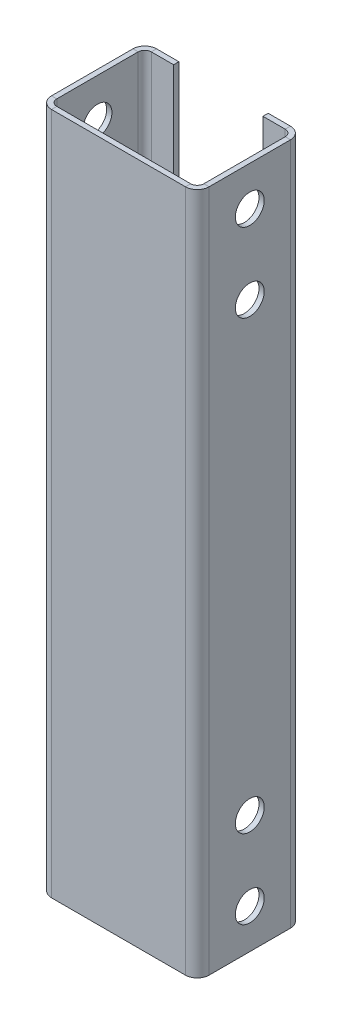
ISO-10303-21;
HEADER;
FILE_DESCRIPTION(('STEP AP214'),'2;1');
FILE_NAME('part.step','',(''),(''),'','','');
FILE_SCHEMA(('AUTOMOTIVE_DESIGN { 1 0 10303 214 1 1 1 1 }'));
ENDSEC;
DATA;
#1=APPLICATION_CONTEXT('core data for automotive mechanical design processes');
#2=APPLICATION_PROTOCOL_DEFINITION('international standard','automotive_design',2000,#1);
#3=PRODUCT_CONTEXT('',#1,'mechanical');
#4=PRODUCT('Part','Part','',(#3));
#5=PRODUCT_RELATED_PRODUCT_CATEGORY('part','',(#4));
#6=PRODUCT_DEFINITION_FORMATION('','',#4);
#7=PRODUCT_DEFINITION_CONTEXT('part definition',#1,'design');
#8=PRODUCT_DEFINITION('design','',#6,#7);
#9=PRODUCT_DEFINITION_SHAPE('','',#8);
#10=(LENGTH_UNIT() NAMED_UNIT(*) SI_UNIT(.MILLI.,.METRE.));
#11=(NAMED_UNIT(*) PLANE_ANGLE_UNIT() SI_UNIT($,.RADIAN.));
#12=(NAMED_UNIT(*) SI_UNIT($,.STERADIAN.) SOLID_ANGLE_UNIT());
#13=UNCERTAINTY_MEASURE_WITH_UNIT(LENGTH_MEASURE(1.E-05),#10,'distance_accuracy_value','');
#14=(GEOMETRIC_REPRESENTATION_CONTEXT(3) GLOBAL_UNCERTAINTY_ASSIGNED_CONTEXT((#13)) GLOBAL_UNIT_ASSIGNED_CONTEXT((#10,
#11,#12)) REPRESENTATION_CONTEXT('',''));
#15=CARTESIAN_POINT('',(0.,0.,0.));
#16=DIRECTION('',(0.,0.,1.));
#17=DIRECTION('',(1.,0.,0.));
#18=AXIS2_PLACEMENT_3D('',#15,#16,#17);
#19=CARTESIAN_POINT('',(-30.,130.,-1.99999999999999));
#20=DIRECTION('',(0.,1.,0.));
#21=DIRECTION('',(0.,0.,1.));
#22=AXIS2_PLACEMENT_3D('',#19,#20,#21);
#23=PLANE('',#22);
#24=DIRECTION('',(0.,0.,-1.));
#25=VECTOR('',#24,1.);
#26=CARTESIAN_POINT('',(-28.,130.,1.04083408558608E-13));
#27=LINE('',#26,#25);
#28=CARTESIAN_POINT('',(-28.0000000000001,130.,-35.5));
#29=VERTEX_POINT('',#28);
#30=CARTESIAN_POINT('',(-28.,130.,-4.49999999999999));
#31=VERTEX_POINT('',#30);
#32=EDGE_CURVE('E376',#29,#31,#27,.F.);
#33=ORIENTED_EDGE('',*,*,#32,.F.);
#34=DIRECTION('',(-1.,0.,0.));
#35=VECTOR('',#34,1.);
#36=CARTESIAN_POINT('',(-28.0000000000001,130.,-35.5));
#37=LINE('',#36,#35);
#38=CARTESIAN_POINT('',(-30.0000000000001,130.,-35.5));
#39=VERTEX_POINT('',#38);
#40=EDGE_CURVE('E304',#29,#39,#37,.T.);
#41=ORIENTED_EDGE('',*,*,#40,.T.);
#42=DIRECTION('',(0.,0.,1.));
#43=VECTOR('',#42,1.);
#44=CARTESIAN_POINT('',(-30.,130.,-1.99999999999999));
#45=LINE('',#44,#43);
#46=CARTESIAN_POINT('',(-30.,130.,-4.49999999999998));
#47=VERTEX_POINT('',#46);
#48=EDGE_CURVE('E370',#39,#47,#45,.T.);
#49=ORIENTED_EDGE('',*,*,#48,.T.);
#50=DIRECTION('',(-1.,0.,0.));
#51=VECTOR('',#50,1.);
#52=CARTESIAN_POINT('',(-28.,130.,-4.49999999999999));
#53=LINE('',#52,#51);
#54=EDGE_CURVE('E384',#31,#47,#53,.T.);
#55=ORIENTED_EDGE('',*,*,#54,.F.);
#56=EDGE_LOOP('',(#33,#41,#49,#55));
#57=FACE_BOUND('',#56,.T.);
#58=ADVANCED_FACE('F118',(#57),#23,.T.);
#59=CARTESIAN_POINT('',(-30.,0.,1.11066371236295E-13));
#60=DIRECTION('',(-1.,0.,0.));
#61=DIRECTION('',(0.,0.,1.));
#62=AXIS2_PLACEMENT_3D('',#59,#60,#61);
#63=PLANE('',#62);
#64=CARTESIAN_POINT('',(-30.0000000000003,115.,-20.));
#65=DIRECTION('',(-1.,0.,0.));
#66=DIRECTION('',(0.,0.,-1.));
#67=AXIS2_PLACEMENT_3D('',#64,#65,#66);
#68=CIRCLE('',#67,5.5);
#69=CARTESIAN_POINT('',(-30.0000000000002,115.,-25.5));
#70=VERTEX_POINT('',#69);
#71=EDGE_CURVE('E480',#70,#70,#68,.T.);
#72=ORIENTED_EDGE('',*,*,#71,.F.);
#73=EDGE_LOOP('',(#72));
#74=FACE_BOUND('',#73,.T.);
#75=CARTESIAN_POINT('',(-30.0000000000003,85.,-20.));
#76=DIRECTION('',(-1.,0.,0.));
#77=DIRECTION('',(0.,0.,-1.));
#78=AXIS2_PLACEMENT_3D('',#75,#76,#77);
#79=CIRCLE('',#78,5.5);
#80=CARTESIAN_POINT('',(-30.0000000000002,85.,-25.5));
#81=VERTEX_POINT('',#80);
#82=EDGE_CURVE('E487',#81,#81,#79,.T.);
#83=ORIENTED_EDGE('',*,*,#82,.F.);
#84=EDGE_LOOP('',(#83));
#85=FACE_BOUND('',#84,.T.);
#86=CARTESIAN_POINT('',(-30.0000000000002,-115.,-20.));
#87=DIRECTION('',(1.,0.,0.));
#88=DIRECTION('',(0.,0.,-1.));
#89=AXIS2_PLACEMENT_3D('',#86,#87,#88);
#90=CIRCLE('',#89,5.5);
#91=CARTESIAN_POINT('',(-30.0000000000002,-115.,-25.5));
#92=VERTEX_POINT('',#91);
#93=EDGE_CURVE('E472',#92,#92,#90,.T.);
#94=ORIENTED_EDGE('',*,*,#93,.T.);
#95=EDGE_LOOP('',(#94));
#96=FACE_BOUND('',#95,.T.);
#97=CARTESIAN_POINT('',(-30.0000000000002,-85.,-20.));
#98=DIRECTION('',(1.,0.,0.));
#99=DIRECTION('',(0.,0.,-1.));
#100=AXIS2_PLACEMENT_3D('',#97,#98,#99);
#101=CIRCLE('',#100,5.5);
#102=CARTESIAN_POINT('',(-30.0000000000002,-85.,-25.5));
#103=VERTEX_POINT('',#102);
#104=EDGE_CURVE('E502',#103,#103,#101,.T.);
#105=ORIENTED_EDGE('',*,*,#104,.T.);
#106=EDGE_LOOP('',(#105));
#107=FACE_BOUND('',#106,.T.);
#108=ORIENTED_EDGE('',*,*,#48,.F.);
#109=DIRECTION('',(0.,1.,0.));
#110=VECTOR('',#109,1.);
#111=CARTESIAN_POINT('',(-30.0000000000001,130.,-35.5));
#112=LINE('',#111,#110);
#113=CARTESIAN_POINT('',(-30.0000000000001,-130.,-35.5));
#114=VERTEX_POINT('',#113);
#115=EDGE_CURVE('E299',#39,#114,#112,.F.);
#116=ORIENTED_EDGE('',*,*,#115,.T.);
#117=DIRECTION('',(0.,0.,-1.));
#118=VECTOR('',#117,1.);
#119=CARTESIAN_POINT('',(-30.0000000000001,-130.,-40.));
#120=LINE('',#119,#118);
#121=CARTESIAN_POINT('',(-30.,-130.,-4.49999999999998));
#122=VERTEX_POINT('',#121);
#123=EDGE_CURVE('E373',#122,#114,#120,.T.);
#124=ORIENTED_EDGE('',*,*,#123,.F.);
#125=DIRECTION('',(0.,1.,0.));
#126=VECTOR('',#125,1.);
#127=CARTESIAN_POINT('',(-30.,0.,-4.49999999999998));
#128=LINE('',#127,#126);
#129=EDGE_CURVE('E381',#122,#47,#128,.T.);
#130=ORIENTED_EDGE('',*,*,#129,.T.);
#131=EDGE_LOOP('',(#108,#116,#124,#130));
#132=FACE_BOUND('',#131,.T.);
#133=ADVANCED_FACE('F543',(#74,#85,#96,#107,#132),#63,.T.);
#134=CARTESIAN_POINT('',(-28.,0.,1.04083408558608E-13));
#135=DIRECTION('',(-1.,0.,0.));
#136=DIRECTION('',(0.,0.,1.));
#137=AXIS2_PLACEMENT_3D('',#134,#135,#136);
#138=PLANE('',#137);
#139=CARTESIAN_POINT('',(-28.0000000000001,115.,-20.));
#140=DIRECTION('',(-1.,0.,0.));
#141=DIRECTION('',(0.,0.,1.));
#142=AXIS2_PLACEMENT_3D('',#139,#140,#141);
#143=CIRCLE('',#142,5.5);
#144=CARTESIAN_POINT('',(-28.,115.,-14.5));
#145=VERTEX_POINT('',#144);
#146=EDGE_CURVE('E499',#145,#145,#143,.F.);
#147=ORIENTED_EDGE('',*,*,#146,.F.);
#148=EDGE_LOOP('',(#147));
#149=FACE_BOUND('',#148,.T.);
#150=CARTESIAN_POINT('',(-28.0000000000001,85.,-20.));
#151=DIRECTION('',(-1.,0.,0.));
#152=DIRECTION('',(0.,0.,1.));
#153=AXIS2_PLACEMENT_3D('',#150,#151,#152);
#154=CIRCLE('',#153,5.5);
#155=CARTESIAN_POINT('',(-28.,85.,-14.5));
#156=VERTEX_POINT('',#155);
#157=EDGE_CURVE('E484',#156,#156,#154,.F.);
#158=ORIENTED_EDGE('',*,*,#157,.F.);
#159=EDGE_LOOP('',(#158));
#160=FACE_BOUND('',#159,.T.);
#161=CARTESIAN_POINT('',(-28.0000000000001,-115.,-20.));
#162=DIRECTION('',(-1.,0.,0.));
#163=DIRECTION('',(0.,0.,1.));
#164=AXIS2_PLACEMENT_3D('',#161,#162,#163);
#165=CIRCLE('',#164,5.5);
#166=CARTESIAN_POINT('',(-28.,-115.,-14.5));
#167=VERTEX_POINT('',#166);
#168=EDGE_CURVE('E298',#167,#167,#165,.T.);
#169=ORIENTED_EDGE('',*,*,#168,.T.);
#170=EDGE_LOOP('',(#169));
#171=FACE_BOUND('',#170,.T.);
#172=CARTESIAN_POINT('',(-28.0000000000001,-85.,-20.));
#173=DIRECTION('',(-1.,0.,0.));
#174=DIRECTION('',(0.,0.,1.));
#175=AXIS2_PLACEMENT_3D('',#172,#173,#174);
#176=CIRCLE('',#175,5.5);
#177=CARTESIAN_POINT('',(-28.,-85.,-14.5));
#178=VERTEX_POINT('',#177);
#179=EDGE_CURVE('E476',#178,#178,#176,.T.);
#180=ORIENTED_EDGE('',*,*,#179,.T.);
#181=EDGE_LOOP('',(#180));
#182=FACE_BOUND('',#181,.T.);
#183=DIRECTION('',(0.,1.,0.));
#184=VECTOR('',#183,1.);
#185=CARTESIAN_POINT('',(-28.0000000000001,130.,-35.5));
#186=LINE('',#185,#184);
#187=CARTESIAN_POINT('',(-28.0000000000001,-130.,-35.5));
#188=VERTEX_POINT('',#187);
#189=EDGE_CURVE('E310',#29,#188,#186,.F.);
#190=ORIENTED_EDGE('',*,*,#189,.F.);
#191=ORIENTED_EDGE('',*,*,#32,.T.);
#192=DIRECTION('',(0.,-1.,0.));
#193=VECTOR('',#192,1.);
#194=CARTESIAN_POINT('',(-28.,-130.,-4.49999999999999));
#195=LINE('',#194,#193);
#196=CARTESIAN_POINT('',(-28.,-130.,-4.49999999999999));
#197=VERTEX_POINT('',#196);
#198=EDGE_CURVE('E387',#197,#31,#195,.F.);
#199=ORIENTED_EDGE('',*,*,#198,.F.);
#200=DIRECTION('',(0.,0.,1.));
#201=VECTOR('',#200,1.);
#202=CARTESIAN_POINT('',(-28.,-130.,1.04083408558608E-13));
#203=LINE('',#202,#201);
#204=EDGE_CURVE('E378',#197,#188,#203,.F.);
#205=ORIENTED_EDGE('',*,*,#204,.T.);
#206=EDGE_LOOP('',(#190,#191,#199,#205));
#207=FACE_BOUND('',#206,.T.);
#208=ADVANCED_FACE('F549',(#149,#160,#171,#182,#207),#138,.F.);
#209=CARTESIAN_POINT('',(30.,-130.,-1.99999999999999));
#210=DIRECTION('',(0.,-1.,0.));
#211=DIRECTION('',(0.,0.,-1.));
#212=AXIS2_PLACEMENT_3D('',#209,#210,#211);
#213=PLANE('',#212);
#214=DIRECTION('',(0.,0.,-1.));
#215=VECTOR('',#214,1.);
#216=CARTESIAN_POINT('',(28.,-130.,1.04083408558608E-13));
#217=LINE('',#216,#215);
#218=CARTESIAN_POINT('',(28.0000000000001,-130.,-35.5));
#219=VERTEX_POINT('',#218);
#220=CARTESIAN_POINT('',(28.,-130.,-4.49999999999999));
#221=VERTEX_POINT('',#220);
#222=EDGE_CURVE('E421',#219,#221,#217,.F.);
#223=ORIENTED_EDGE('',*,*,#222,.F.);
#224=DIRECTION('',(1.,0.,0.));
#225=VECTOR('',#224,1.);
#226=CARTESIAN_POINT('',(28.0000000000001,-130.,-35.5));
#227=LINE('',#226,#225);
#228=CARTESIAN_POINT('',(30.0000000000001,-130.,-35.5));
#229=VERTEX_POINT('',#228);
#230=EDGE_CURVE('E355',#219,#229,#227,.T.);
#231=ORIENTED_EDGE('',*,*,#230,.T.);
#232=DIRECTION('',(0.,0.,1.));
#233=VECTOR('',#232,1.);
#234=CARTESIAN_POINT('',(30.,-130.,-1.99999999999999));
#235=LINE('',#234,#233);
#236=CARTESIAN_POINT('',(30.,-130.,-4.49999999999999));
#237=VERTEX_POINT('',#236);
#238=EDGE_CURVE('E415',#229,#237,#235,.T.);
#239=ORIENTED_EDGE('',*,*,#238,.T.);
#240=DIRECTION('',(1.,0.,0.));
#241=VECTOR('',#240,1.);
#242=CARTESIAN_POINT('',(28.,-130.,-4.5));
#243=LINE('',#242,#241);
#244=EDGE_CURVE('E430',#221,#237,#243,.T.);
#245=ORIENTED_EDGE('',*,*,#244,.F.);
#246=EDGE_LOOP('',(#223,#231,#239,#245));
#247=FACE_BOUND('',#246,.T.);
#248=ADVANCED_FACE('F581',(#247),#213,.T.);
#249=CARTESIAN_POINT('',(30.,0.,1.11066371236295E-13));
#250=DIRECTION('',(1.,0.,0.));
#251=DIRECTION('',(0.,0.,-1.));
#252=AXIS2_PLACEMENT_3D('',#249,#250,#251);
#253=PLANE('',#252);
#254=CARTESIAN_POINT('',(30.0000000000001,115.,-19.9999999999998));
#255=DIRECTION('',(1.,0.,0.));
#256=DIRECTION('',(0.,0.,-1.));
#257=AXIS2_PLACEMENT_3D('',#254,#255,#256);
#258=CIRCLE('',#257,5.5);
#259=CARTESIAN_POINT('',(30.0000000000001,115.,-25.4999999999998));
#260=VERTEX_POINT('',#259);
#261=EDGE_CURVE('E496',#260,#260,#258,.F.);
#262=ORIENTED_EDGE('',*,*,#261,.T.);
#263=EDGE_LOOP('',(#262));
#264=FACE_BOUND('',#263,.T.);
#265=CARTESIAN_POINT('',(30.0000000000001,85.,-19.9999999999998));
#266=DIRECTION('',(1.,0.,0.));
#267=DIRECTION('',(0.,0.,-1.));
#268=AXIS2_PLACEMENT_3D('',#265,#266,#267);
#269=CIRCLE('',#268,5.5);
#270=CARTESIAN_POINT('',(30.0000000000001,85.,-25.4999999999998));
#271=VERTEX_POINT('',#270);
#272=EDGE_CURVE('E479',#271,#271,#269,.F.);
#273=ORIENTED_EDGE('',*,*,#272,.T.);
#274=EDGE_LOOP('',(#273));
#275=FACE_BOUND('',#274,.T.);
#276=CARTESIAN_POINT('',(30.0000000000001,-115.,-19.9999999999998));
#277=DIRECTION('',(1.,0.,0.));
#278=DIRECTION('',(0.,0.,-1.));
#279=AXIS2_PLACEMENT_3D('',#276,#277,#278);
#280=CIRCLE('',#279,5.5);
#281=CARTESIAN_POINT('',(30.0000000000001,-115.,-25.4999999999998));
#282=VERTEX_POINT('',#281);
#283=EDGE_CURVE('E475',#282,#282,#280,.T.);
#284=ORIENTED_EDGE('',*,*,#283,.F.);
#285=EDGE_LOOP('',(#284));
#286=FACE_BOUND('',#285,.T.);
#287=CARTESIAN_POINT('',(30.0000000000001,-85.,-19.9999999999998));
#288=DIRECTION('',(1.,0.,0.));
#289=DIRECTION('',(0.,0.,-1.));
#290=AXIS2_PLACEMENT_3D('',#287,#288,#289);
#291=CIRCLE('',#290,5.5);
#292=CARTESIAN_POINT('',(30.0000000000001,-85.,-25.4999999999998));
#293=VERTEX_POINT('',#292);
#294=EDGE_CURVE('E471',#293,#293,#291,.T.);
#295=ORIENTED_EDGE('',*,*,#294,.F.);
#296=EDGE_LOOP('',(#295));
#297=FACE_BOUND('',#296,.T.);
#298=ORIENTED_EDGE('',*,*,#238,.F.);
#299=DIRECTION('',(0.,-1.,0.));
#300=VECTOR('',#299,1.);
#301=CARTESIAN_POINT('',(30.0000000000001,-130.,-35.5));
#302=LINE('',#301,#300);
#303=CARTESIAN_POINT('',(30.0000000000001,130.,-35.5));
#304=VERTEX_POINT('',#303);
#305=EDGE_CURVE('E350',#229,#304,#302,.F.);
#306=ORIENTED_EDGE('',*,*,#305,.T.);
#307=DIRECTION('',(0.,0.,-1.));
#308=VECTOR('',#307,1.);
#309=CARTESIAN_POINT('',(30.0000000000001,130.,-40.));
#310=LINE('',#309,#308);
#311=CARTESIAN_POINT('',(30.,130.,-4.49999999999999));
#312=VERTEX_POINT('',#311);
#313=EDGE_CURVE('E418',#312,#304,#310,.T.);
#314=ORIENTED_EDGE('',*,*,#313,.F.);
#315=DIRECTION('',(0.,-1.,0.));
#316=VECTOR('',#315,1.);
#317=CARTESIAN_POINT('',(30.,0.,-4.49999999999999));
#318=LINE('',#317,#316);
#319=EDGE_CURVE('E426',#312,#237,#318,.T.);
#320=ORIENTED_EDGE('',*,*,#319,.T.);
#321=EDGE_LOOP('',(#298,#306,#314,#320));
#322=FACE_BOUND('',#321,.T.);
#323=ADVANCED_FACE('F577',(#264,#275,#286,#297,#322),#253,.T.);
#324=CARTESIAN_POINT('',(28.,0.,1.04083408558608E-13));
#325=DIRECTION('',(1.,0.,0.));
#326=DIRECTION('',(0.,0.,-1.));
#327=AXIS2_PLACEMENT_3D('',#324,#325,#326);
#328=PLANE('',#327);
#329=CARTESIAN_POINT('',(28.0000000000001,115.,-19.9999999999998));
#330=DIRECTION('',(1.,0.,0.));
#331=DIRECTION('',(0.,0.,-1.));
#332=AXIS2_PLACEMENT_3D('',#329,#330,#331);
#333=CIRCLE('',#332,5.5);
#334=CARTESIAN_POINT('',(28.0000000000001,115.,-25.4999999999998));
#335=VERTEX_POINT('',#334);
#336=EDGE_CURVE('E122',#335,#335,#333,.F.);
#337=ORIENTED_EDGE('',*,*,#336,.F.);
#338=EDGE_LOOP('',(#337));
#339=FACE_BOUND('',#338,.T.);
#340=CARTESIAN_POINT('',(28.0000000000001,85.,-19.9999999999998));
#341=DIRECTION('',(1.,0.,0.));
#342=DIRECTION('',(0.,0.,-1.));
#343=AXIS2_PLACEMENT_3D('',#340,#341,#342);
#344=CIRCLE('',#343,5.5);
#345=CARTESIAN_POINT('',(28.0000000000001,85.,-25.4999999999998));
#346=VERTEX_POINT('',#345);
#347=EDGE_CURVE('E477',#346,#346,#344,.F.);
#348=ORIENTED_EDGE('',*,*,#347,.F.);
#349=EDGE_LOOP('',(#348));
#350=FACE_BOUND('',#349,.T.);
#351=CARTESIAN_POINT('',(28.0000000000001,-115.,-19.9999999999998));
#352=DIRECTION('',(1.,0.,0.));
#353=DIRECTION('',(0.,0.,-1.));
#354=AXIS2_PLACEMENT_3D('',#351,#352,#353);
#355=CIRCLE('',#354,5.5);
#356=CARTESIAN_POINT('',(28.0000000000001,-115.,-25.4999999999998));
#357=VERTEX_POINT('',#356);
#358=EDGE_CURVE('E473',#357,#357,#355,.T.);
#359=ORIENTED_EDGE('',*,*,#358,.T.);
#360=EDGE_LOOP('',(#359));
#361=FACE_BOUND('',#360,.T.);
#362=CARTESIAN_POINT('',(28.0000000000001,-85.,-19.9999999999998));
#363=DIRECTION('',(1.,0.,0.));
#364=DIRECTION('',(0.,0.,-1.));
#365=AXIS2_PLACEMENT_3D('',#362,#363,#364);
#366=CIRCLE('',#365,5.5);
#367=CARTESIAN_POINT('',(28.0000000000001,-85.,-25.4999999999998));
#368=VERTEX_POINT('',#367);
#369=EDGE_CURVE('E468',#368,#368,#366,.T.);
#370=ORIENTED_EDGE('',*,*,#369,.T.);
#371=EDGE_LOOP('',(#370));
#372=FACE_BOUND('',#371,.T.);
#373=DIRECTION('',(0.,-1.,0.));
#374=VECTOR('',#373,1.);
#375=CARTESIAN_POINT('',(28.0000000000001,-130.,-35.5));
#376=LINE('',#375,#374);
#377=CARTESIAN_POINT('',(28.0000000000001,130.,-35.5));
#378=VERTEX_POINT('',#377);
#379=EDGE_CURVE('E361',#219,#378,#376,.F.);
#380=ORIENTED_EDGE('',*,*,#379,.F.);
#381=ORIENTED_EDGE('',*,*,#222,.T.);
#382=DIRECTION('',(0.,1.,0.));
#383=VECTOR('',#382,1.);
#384=CARTESIAN_POINT('',(28.,130.,-4.49999999999999));
#385=LINE('',#384,#383);
#386=CARTESIAN_POINT('',(28.,130.,-4.49999999999999));
#387=VERTEX_POINT('',#386);
#388=EDGE_CURVE('E433',#387,#221,#385,.F.);
#389=ORIENTED_EDGE('',*,*,#388,.F.);
#390=DIRECTION('',(0.,0.,1.));
#391=VECTOR('',#390,1.);
#392=CARTESIAN_POINT('',(28.,130.,1.04083408558608E-13));
#393=LINE('',#392,#391);
#394=EDGE_CURVE('E423',#387,#378,#393,.F.);
#395=ORIENTED_EDGE('',*,*,#394,.T.);
#396=EDGE_LOOP('',(#380,#381,#389,#395));
#397=FACE_BOUND('',#396,.T.);
#398=ADVANCED_FACE('F580',(#339,#350,#361,#372,#397),#328,.F.);
#399=CARTESIAN_POINT('',(0.,0.,-2.));
#400=DIRECTION('',(0.,0.,-1.));
#401=DIRECTION('',(-1.,0.,0.));
#402=AXIS2_PLACEMENT_3D('',#399,#400,#401);
#403=PLANE('',#402);
#404=DIRECTION('',(1.,0.,0.));
#405=VECTOR('',#404,1.);
#406=CARTESIAN_POINT('',(-30.,-130.,-2.));
#407=LINE('',#406,#405);
#408=CARTESIAN_POINT('',(-25.5,-130.,-2.));
#409=VERTEX_POINT('',#408);
#410=CARTESIAN_POINT('',(25.5,-130.,-2.));
#411=VERTEX_POINT('',#410);
#412=EDGE_CURVE('E13',#409,#411,#407,.T.);
#413=ORIENTED_EDGE('',*,*,#412,.F.);
#414=DIRECTION('',(0.,1.,0.));
#415=VECTOR('',#414,1.);
#416=CARTESIAN_POINT('',(-25.5,130.,-2.));
#417=LINE('',#416,#415);
#418=CARTESIAN_POINT('',(-25.5,130.,-2.));
#419=VERTEX_POINT('',#418);
#420=EDGE_CURVE('E404',#419,#409,#417,.F.);
#421=ORIENTED_EDGE('',*,*,#420,.F.);
#422=DIRECTION('',(-1.,0.,0.));
#423=VECTOR('',#422,1.);
#424=CARTESIAN_POINT('',(-30.,130.,-2.));
#425=LINE('',#424,#423);
#426=CARTESIAN_POINT('',(25.5,130.,-2.));
#427=VERTEX_POINT('',#426);
#428=EDGE_CURVE('E127',#427,#419,#425,.T.);
#429=ORIENTED_EDGE('',*,*,#428,.F.);
#430=DIRECTION('',(0.,-1.,0.));
#431=VECTOR('',#430,1.);
#432=CARTESIAN_POINT('',(25.5,-130.,-2.));
#433=LINE('',#432,#431);
#434=EDGE_CURVE('E451',#411,#427,#433,.F.);
#435=ORIENTED_EDGE('',*,*,#434,.F.);
#436=EDGE_LOOP('',(#413,#421,#429,#435));
#437=FACE_BOUND('',#436,.T.);
#438=ADVANCED_FACE('F585',(#437),#403,.T.);
#439=CARTESIAN_POINT('',(0.,0.,0.));
#440=DIRECTION('',(0.,0.,-1.));
#441=DIRECTION('',(-1.,0.,0.));
#442=AXIS2_PLACEMENT_3D('',#439,#440,#441);
#443=PLANE('',#442);
#444=DIRECTION('',(0.,1.,0.));
#445=VECTOR('',#444,1.);
#446=CARTESIAN_POINT('',(-25.5,130.,0.));
#447=LINE('',#446,#445);
#448=CARTESIAN_POINT('',(-25.5,130.,0.));
#449=VERTEX_POINT('',#448);
#450=CARTESIAN_POINT('',(-25.5,-130.,0.));
#451=VERTEX_POINT('',#450);
#452=EDGE_CURVE('E392',#449,#451,#447,.F.);
#453=ORIENTED_EDGE('',*,*,#452,.T.);
#454=DIRECTION('',(1.,0.,0.));
#455=VECTOR('',#454,1.);
#456=CARTESIAN_POINT('',(-30.,-130.,0.));
#457=LINE('',#456,#455);
#458=CARTESIAN_POINT('',(25.5,-130.,0.));
#459=VERTEX_POINT('',#458);
#460=EDGE_CURVE('E463',#451,#459,#457,.T.);
#461=ORIENTED_EDGE('',*,*,#460,.T.);
#462=DIRECTION('',(0.,-1.,0.));
#463=VECTOR('',#462,1.);
#464=CARTESIAN_POINT('',(25.5,-130.,0.));
#465=LINE('',#464,#463);
#466=CARTESIAN_POINT('',(25.5,130.,0.));
#467=VERTEX_POINT('',#466);
#468=EDGE_CURVE('E439',#459,#467,#465,.F.);
#469=ORIENTED_EDGE('',*,*,#468,.T.);
#470=DIRECTION('',(-1.,0.,0.));
#471=VECTOR('',#470,1.);
#472=CARTESIAN_POINT('',(-30.,130.,0.));
#473=LINE('',#472,#471);
#474=EDGE_CURVE('E459',#467,#449,#473,.T.);
#475=ORIENTED_EDGE('',*,*,#474,.T.);
#476=EDGE_LOOP('',(#453,#461,#469,#475));
#477=FACE_BOUND('',#476,.T.);
#478=ADVANCED_FACE('F612',(#477),#443,.F.);
#479=CARTESIAN_POINT('',(-30.,130.,-2.));
#480=DIRECTION('',(0.,1.,0.));
#481=DIRECTION('',(0.,0.,1.));
#482=AXIS2_PLACEMENT_3D('',#479,#480,#481);
#483=PLANE('',#482);
#484=ORIENTED_EDGE('',*,*,#428,.T.);
#485=DIRECTION('',(0.,0.,1.));
#486=VECTOR('',#485,1.);
#487=CARTESIAN_POINT('',(-25.5,130.,-2.));
#488=LINE('',#487,#486);
#489=EDGE_CURVE('E398',#419,#449,#488,.T.);
#490=ORIENTED_EDGE('',*,*,#489,.T.);
#491=ORIENTED_EDGE('',*,*,#474,.F.);
#492=DIRECTION('',(0.,0.,1.));
#493=VECTOR('',#492,1.);
#494=CARTESIAN_POINT('',(25.5,130.,-2.));
#495=LINE('',#494,#493);
#496=EDGE_CURVE('E456',#427,#467,#495,.T.);
#497=ORIENTED_EDGE('',*,*,#496,.F.);
#498=EDGE_LOOP('',(#484,#490,#491,#497));
#499=FACE_BOUND('',#498,.T.);
#500=ADVANCED_FACE('F120',(#499),#483,.T.);
#501=CARTESIAN_POINT('',(-30.,-130.,-2.));
#502=DIRECTION('',(0.,-1.,0.));
#503=DIRECTION('',(0.,0.,-1.));
#504=AXIS2_PLACEMENT_3D('',#501,#502,#503);
#505=PLANE('',#504);
#506=DIRECTION('',(0.,0.,1.));
#507=VECTOR('',#506,1.);
#508=CARTESIAN_POINT('',(-25.5,-130.,-2.));
#509=LINE('',#508,#507);
#510=EDGE_CURVE('E409',#409,#451,#509,.T.);
#511=ORIENTED_EDGE('',*,*,#510,.F.);
#512=ORIENTED_EDGE('',*,*,#412,.T.);
#513=DIRECTION('',(0.,0.,1.));
#514=VECTOR('',#513,1.);
#515=CARTESIAN_POINT('',(25.5,-130.,-2.));
#516=LINE('',#515,#514);
#517=EDGE_CURVE('E445',#411,#459,#516,.T.);
#518=ORIENTED_EDGE('',*,*,#517,.T.);
#519=ORIENTED_EDGE('',*,*,#460,.F.);
#520=EDGE_LOOP('',(#511,#512,#518,#519));
#521=FACE_BOUND('',#520,.T.);
#522=ADVANCED_FACE('F605',(#521),#505,.T.);
#523=CARTESIAN_POINT('',(25.5,130.,-4.5));
#524=DIRECTION('',(0.,1.,0.));
#525=DIRECTION('',(0.,0.,1.));
#526=AXIS2_PLACEMENT_3D('',#523,#524,#525);
#527=PLANE('',#526);
#528=DIRECTION('',(1.,0.,0.));
#529=VECTOR('',#528,1.);
#530=CARTESIAN_POINT('',(30.,130.,-4.49999999999998));
#531=LINE('',#530,#529);
#532=EDGE_CURVE('E412',#387,#312,#531,.T.);
#533=ORIENTED_EDGE('',*,*,#532,.F.);
#534=CARTESIAN_POINT('',(25.5,130.,-4.5));
#535=DIRECTION('',(0.,-1.,0.));
#536=DIRECTION('',(0.,0.,-1.));
#537=AXIS2_PLACEMENT_3D('',#534,#535,#536);
#538=CIRCLE('',#537,2.5);
#539=EDGE_CURVE('E448',#427,#387,#538,.F.);
#540=ORIENTED_EDGE('',*,*,#539,.F.);
#541=ORIENTED_EDGE('',*,*,#496,.T.);
#542=CARTESIAN_POINT('',(25.5,130.,-4.5));
#543=DIRECTION('',(0.,-1.,0.));
#544=DIRECTION('',(0.,0.,-1.));
#545=AXIS2_PLACEMENT_3D('',#542,#543,#544);
#546=CIRCLE('',#545,4.5);
#547=EDGE_CURVE('E441',#467,#312,#546,.F.);
#548=ORIENTED_EDGE('',*,*,#547,.T.);
#549=EDGE_LOOP('',(#533,#540,#541,#548));
#550=FACE_BOUND('',#549,.T.);
#551=ADVANCED_FACE('F602',(#550),#527,.T.);
#552=CARTESIAN_POINT('',(25.5,-130.,-4.5));
#553=DIRECTION('',(0.,1.,0.));
#554=DIRECTION('',(0.,0.,1.));
#555=AXIS2_PLACEMENT_3D('',#552,#553,#554);
#556=PLANE('',#555);
#557=CARTESIAN_POINT('',(25.5,-130.,-4.5));
#558=DIRECTION('',(0.,-1.,0.));
#559=DIRECTION('',(0.,0.,-1.));
#560=AXIS2_PLACEMENT_3D('',#557,#558,#559);
#561=CIRCLE('',#560,2.5);
#562=EDGE_CURVE('E417',#221,#411,#561,.T.);
#563=ORIENTED_EDGE('',*,*,#562,.F.);
#564=ORIENTED_EDGE('',*,*,#244,.T.);
#565=CARTESIAN_POINT('',(25.5,-130.,-4.5));
#566=DIRECTION('',(0.,-1.,0.));
#567=DIRECTION('',(0.,0.,-1.));
#568=AXIS2_PLACEMENT_3D('',#565,#566,#567);
#569=CIRCLE('',#568,4.5);
#570=EDGE_CURVE('E442',#237,#459,#569,.T.);
#571=ORIENTED_EDGE('',*,*,#570,.T.);
#572=ORIENTED_EDGE('',*,*,#517,.F.);
#573=EDGE_LOOP('',(#563,#564,#571,#572));
#574=FACE_BOUND('',#573,.T.);
#575=ADVANCED_FACE('F597',(#574),#556,.F.);
#576=CARTESIAN_POINT('',(25.5,-130.,-4.5));
#577=DIRECTION('',(0.,-1.,0.));
#578=DIRECTION('',(1.,0.,0.));
#579=AXIS2_PLACEMENT_3D('',#576,#577,#578);
#580=CYLINDRICAL_SURFACE('',#579,4.5);
#581=ORIENTED_EDGE('',*,*,#468,.F.);
#582=ORIENTED_EDGE('',*,*,#570,.F.);
#583=ORIENTED_EDGE('',*,*,#319,.F.);
#584=ORIENTED_EDGE('',*,*,#547,.F.);
#585=EDGE_LOOP('',(#581,#582,#583,#584));
#586=FACE_BOUND('',#585,.T.);
#587=ADVANCED_FACE('F594',(#586),#580,.T.);
#588=CARTESIAN_POINT('',(25.5,-130.,-4.5));
#589=DIRECTION('',(0.,-1.,0.));
#590=DIRECTION('',(1.,0.,0.));
#591=AXIS2_PLACEMENT_3D('',#588,#589,#590);
#592=CYLINDRICAL_SURFACE('',#591,2.5);
#593=ORIENTED_EDGE('',*,*,#434,.T.);
#594=ORIENTED_EDGE('',*,*,#539,.T.);
#595=ORIENTED_EDGE('',*,*,#388,.T.);
#596=ORIENTED_EDGE('',*,*,#562,.T.);
#597=EDGE_LOOP('',(#593,#594,#595,#596));
#598=FACE_BOUND('',#597,.T.);
#599=ADVANCED_FACE('F592',(#598),#592,.F.);
#600=CARTESIAN_POINT('',(30.0000000000001,130.,-40.));
#601=DIRECTION('',(0.,1.,0.));
#602=DIRECTION('',(0.,0.,1.));
#603=AXIS2_PLACEMENT_3D('',#600,#601,#602);
#604=PLANE('',#603);
#605=DIRECTION('',(1.,0.,0.));
#606=VECTOR('',#605,1.);
#607=CARTESIAN_POINT('',(28.0000000000001,130.,-35.5));
#608=LINE('',#607,#606);
#609=EDGE_CURVE('E365',#378,#304,#608,.T.);
#610=ORIENTED_EDGE('',*,*,#609,.F.);
#611=ORIENTED_EDGE('',*,*,#394,.F.);
#612=ORIENTED_EDGE('',*,*,#532,.T.);
#613=ORIENTED_EDGE('',*,*,#313,.T.);
#614=EDGE_LOOP('',(#610,#611,#612,#613));
#615=FACE_BOUND('',#614,.T.);
#616=ADVANCED_FACE('F572',(#615),#604,.T.);
#617=CARTESIAN_POINT('',(-25.5,-130.,-4.5));
#618=DIRECTION('',(0.,-1.,0.));
#619=DIRECTION('',(0.,0.,-1.));
#620=AXIS2_PLACEMENT_3D('',#617,#618,#619);
#621=PLANE('',#620);
#622=DIRECTION('',(-1.,0.,0.));
#623=VECTOR('',#622,1.);
#624=CARTESIAN_POINT('',(-30.,-130.,-4.49999999999998));
#625=LINE('',#624,#623);
#626=EDGE_CURVE('E367',#197,#122,#625,.T.);
#627=ORIENTED_EDGE('',*,*,#626,.F.);
#628=CARTESIAN_POINT('',(-25.5,-130.,-4.5));
#629=DIRECTION('',(0.,1.,0.));
#630=DIRECTION('',(0.,0.,1.));
#631=AXIS2_PLACEMENT_3D('',#628,#629,#630);
#632=CIRCLE('',#631,2.5);
#633=EDGE_CURVE('E401',#409,#197,#632,.F.);
#634=ORIENTED_EDGE('',*,*,#633,.F.);
#635=ORIENTED_EDGE('',*,*,#510,.T.);
#636=CARTESIAN_POINT('',(-25.5,-130.,-4.5));
#637=DIRECTION('',(0.,1.,0.));
#638=DIRECTION('',(0.,0.,1.));
#639=AXIS2_PLACEMENT_3D('',#636,#637,#638);
#640=CIRCLE('',#639,4.5);
#641=EDGE_CURVE('E394',#451,#122,#640,.F.);
#642=ORIENTED_EDGE('',*,*,#641,.T.);
#643=EDGE_LOOP('',(#627,#634,#635,#642));
#644=FACE_BOUND('',#643,.T.);
#645=ADVANCED_FACE('F569',(#644),#621,.T.);
#646=CARTESIAN_POINT('',(-25.5,130.,-4.5));
#647=DIRECTION('',(0.,-1.,0.));
#648=DIRECTION('',(0.,0.,-1.));
#649=AXIS2_PLACEMENT_3D('',#646,#647,#648);
#650=PLANE('',#649);
#651=CARTESIAN_POINT('',(-25.5,130.,-4.5));
#652=DIRECTION('',(0.,1.,0.));
#653=DIRECTION('',(0.,0.,1.));
#654=AXIS2_PLACEMENT_3D('',#651,#652,#653);
#655=CIRCLE('',#654,2.5);
#656=EDGE_CURVE('E372',#31,#419,#655,.T.);
#657=ORIENTED_EDGE('',*,*,#656,.F.);
#658=ORIENTED_EDGE('',*,*,#54,.T.);
#659=CARTESIAN_POINT('',(-25.5,130.,-4.5));
#660=DIRECTION('',(0.,1.,0.));
#661=DIRECTION('',(0.,0.,1.));
#662=AXIS2_PLACEMENT_3D('',#659,#660,#661);
#663=CIRCLE('',#662,4.5);
#664=EDGE_CURVE('E395',#47,#449,#663,.T.);
#665=ORIENTED_EDGE('',*,*,#664,.T.);
#666=ORIENTED_EDGE('',*,*,#489,.F.);
#667=EDGE_LOOP('',(#657,#658,#665,#666));
#668=FACE_BOUND('',#667,.T.);
#669=ADVANCED_FACE('F564',(#668),#650,.F.);
#670=CARTESIAN_POINT('',(-25.5,130.,-4.5));
#671=DIRECTION('',(0.,1.,0.));
#672=DIRECTION('',(-1.,0.,0.));
#673=AXIS2_PLACEMENT_3D('',#670,#671,#672);
#674=CYLINDRICAL_SURFACE('',#673,4.5);
#675=ORIENTED_EDGE('',*,*,#452,.F.);
#676=ORIENTED_EDGE('',*,*,#664,.F.);
#677=ORIENTED_EDGE('',*,*,#129,.F.);
#678=ORIENTED_EDGE('',*,*,#641,.F.);
#679=EDGE_LOOP('',(#675,#676,#677,#678));
#680=FACE_BOUND('',#679,.T.);
#681=ADVANCED_FACE('F561',(#680),#674,.T.);
#682=CARTESIAN_POINT('',(-25.5,130.,-4.5));
#683=DIRECTION('',(0.,1.,0.));
#684=DIRECTION('',(-1.,0.,0.));
#685=AXIS2_PLACEMENT_3D('',#682,#683,#684);
#686=CYLINDRICAL_SURFACE('',#685,2.5);
#687=ORIENTED_EDGE('',*,*,#420,.T.);
#688=ORIENTED_EDGE('',*,*,#633,.T.);
#689=ORIENTED_EDGE('',*,*,#198,.T.);
#690=ORIENTED_EDGE('',*,*,#656,.T.);
#691=EDGE_LOOP('',(#687,#688,#689,#690));
#692=FACE_BOUND('',#691,.T.);
#693=ADVANCED_FACE('F559',(#692),#686,.F.);
#694=CARTESIAN_POINT('',(-30.0000000000001,-130.,-40.));
#695=DIRECTION('',(0.,-1.,0.));
#696=DIRECTION('',(0.,0.,-1.));
#697=AXIS2_PLACEMENT_3D('',#694,#695,#696);
#698=PLANE('',#697);
#699=DIRECTION('',(-1.,0.,0.));
#700=VECTOR('',#699,1.);
#701=CARTESIAN_POINT('',(-28.0000000000001,-130.,-35.5));
#702=LINE('',#701,#700);
#703=EDGE_CURVE('E315',#188,#114,#702,.T.);
#704=ORIENTED_EDGE('',*,*,#703,.F.);
#705=ORIENTED_EDGE('',*,*,#204,.F.);
#706=ORIENTED_EDGE('',*,*,#626,.T.);
#707=ORIENTED_EDGE('',*,*,#123,.T.);
#708=EDGE_LOOP('',(#704,#705,#706,#707));
#709=FACE_BOUND('',#708,.T.);
#710=ADVANCED_FACE('F555',(#709),#698,.T.);
#711=CARTESIAN_POINT('',(25.5000000000001,130.,-35.5));
#712=DIRECTION('',(0.,1.,0.));
#713=DIRECTION('',(0.,0.,1.));
#714=AXIS2_PLACEMENT_3D('',#711,#712,#713);
#715=PLANE('',#714);
#716=DIRECTION('',(0.,0.,1.));
#717=VECTOR('',#716,1.);
#718=CARTESIAN_POINT('',(25.5000000000001,130.,-40.));
#719=LINE('',#718,#717);
#720=CARTESIAN_POINT('',(25.5000000000001,130.,-38.));
#721=VERTEX_POINT('',#720);
#722=CARTESIAN_POINT('',(25.5000000000002,130.,-40.));
#723=VERTEX_POINT('',#722);
#724=EDGE_CURVE('E317',#721,#723,#719,.F.);
#725=ORIENTED_EDGE('',*,*,#724,.F.);
#726=CARTESIAN_POINT('',(25.5000000000001,130.,-35.5));
#727=DIRECTION('',(0.,-1.,0.));
#728=DIRECTION('',(0.,0.,-1.));
#729=AXIS2_PLACEMENT_3D('',#726,#727,#728);
#730=CIRCLE('',#729,2.5);
#731=EDGE_CURVE('E358',#378,#721,#730,.F.);
#732=ORIENTED_EDGE('',*,*,#731,.F.);
#733=ORIENTED_EDGE('',*,*,#609,.T.);
#734=CARTESIAN_POINT('',(25.5000000000001,130.,-35.5));
#735=DIRECTION('',(0.,-1.,0.));
#736=DIRECTION('',(0.,0.,-1.));
#737=AXIS2_PLACEMENT_3D('',#734,#735,#736);
#738=CIRCLE('',#737,4.5);
#739=EDGE_CURVE('E143',#304,#723,#738,.F.);
#740=ORIENTED_EDGE('',*,*,#739,.T.);
#741=EDGE_LOOP('',(#725,#732,#733,#740));
#742=FACE_BOUND('',#741,.T.);
#743=ADVANCED_FACE('F558',(#742),#715,.T.);
#744=CARTESIAN_POINT('',(25.5000000000001,-130.,-35.5));
#745=DIRECTION('',(0.,1.,0.));
#746=DIRECTION('',(0.,0.,1.));
#747=AXIS2_PLACEMENT_3D('',#744,#745,#746);
#748=PLANE('',#747);
#749=CARTESIAN_POINT('',(25.5000000000001,-130.,-35.5));
#750=DIRECTION('',(0.,-1.,0.));
#751=DIRECTION('',(0.,0.,-1.));
#752=AXIS2_PLACEMENT_3D('',#749,#750,#751);
#753=CIRCLE('',#752,2.5);
#754=CARTESIAN_POINT('',(25.5000000000001,-130.,-38.));
#755=VERTEX_POINT('',#754);
#756=EDGE_CURVE('E323',#755,#219,#753,.T.);
#757=ORIENTED_EDGE('',*,*,#756,.F.);
#758=DIRECTION('',(0.,0.,1.));
#759=VECTOR('',#758,1.);
#760=CARTESIAN_POINT('',(25.5000000000001,-130.,-38.));
#761=LINE('',#760,#759);
#762=CARTESIAN_POINT('',(25.5000000000001,-130.,-40.));
#763=VERTEX_POINT('',#762);
#764=EDGE_CURVE('E343',#755,#763,#761,.F.);
#765=ORIENTED_EDGE('',*,*,#764,.T.);
#766=CARTESIAN_POINT('',(25.5000000000001,-130.,-35.5));
#767=DIRECTION('',(0.,-1.,0.));
#768=DIRECTION('',(0.,0.,-1.));
#769=AXIS2_PLACEMENT_3D('',#766,#767,#768);
#770=CIRCLE('',#769,4.5);
#771=EDGE_CURVE('E353',#763,#229,#770,.T.);
#772=ORIENTED_EDGE('',*,*,#771,.T.);
#773=ORIENTED_EDGE('',*,*,#230,.F.);
#774=EDGE_LOOP('',(#757,#765,#772,#773));
#775=FACE_BOUND('',#774,.T.);
#776=ADVANCED_FACE('F659',(#775),#748,.F.);
#777=CARTESIAN_POINT('',(25.5000000000001,-130.,-35.5));
#778=DIRECTION('',(0.,-1.,0.));
#779=DIRECTION('',(0.,0.,-1.));
#780=AXIS2_PLACEMENT_3D('',#777,#778,#779);
#781=CYLINDRICAL_SURFACE('',#780,4.5);
#782=ORIENTED_EDGE('',*,*,#305,.F.);
#783=ORIENTED_EDGE('',*,*,#771,.F.);
#784=DIRECTION('',(0.,-1.,0.));
#785=VECTOR('',#784,1.);
#786=CARTESIAN_POINT('',(25.5000000000001,130.,-40.));
#787=LINE('',#786,#785);
#788=EDGE_CURVE('E341',#763,#723,#787,.F.);
#789=ORIENTED_EDGE('',*,*,#788,.T.);
#790=ORIENTED_EDGE('',*,*,#739,.F.);
#791=EDGE_LOOP('',(#782,#783,#789,#790));
#792=FACE_BOUND('',#791,.T.);
#793=ADVANCED_FACE('F684',(#792),#781,.T.);
#794=CARTESIAN_POINT('',(25.5000000000001,-130.,-35.5));
#795=DIRECTION('',(0.,-1.,0.));
#796=DIRECTION('',(0.,0.,-1.));
#797=AXIS2_PLACEMENT_3D('',#794,#795,#796);
#798=CYLINDRICAL_SURFACE('',#797,2.5);
#799=ORIENTED_EDGE('',*,*,#379,.T.);
#800=ORIENTED_EDGE('',*,*,#731,.T.);
#801=DIRECTION('',(0.,-1.,0.));
#802=VECTOR('',#801,1.);
#803=CARTESIAN_POINT('',(25.5000000000001,130.,-38.));
#804=LINE('',#803,#802);
#805=EDGE_CURVE('E346',#721,#755,#804,.T.);
#806=ORIENTED_EDGE('',*,*,#805,.T.);
#807=ORIENTED_EDGE('',*,*,#756,.T.);
#808=EDGE_LOOP('',(#799,#800,#806,#807));
#809=FACE_BOUND('',#808,.T.);
#810=ADVANCED_FACE('F662',(#809),#798,.F.);
#811=CARTESIAN_POINT('',(17.0000000000001,-130.,-40.0000000000001));
#812=DIRECTION('',(0.,1.,0.));
#813=DIRECTION('',(0.,0.,1.));
#814=AXIS2_PLACEMENT_3D('',#811,#812,#813);
#815=PLANE('',#814);
#816=ORIENTED_EDGE('',*,*,#764,.F.);
#817=DIRECTION('',(1.,0.,0.));
#818=VECTOR('',#817,1.);
#819=CARTESIAN_POINT('',(17.0000000000001,-130.,-38.0000000000001));
#820=LINE('',#819,#818);
#821=CARTESIAN_POINT('',(17.0000000000001,-130.,-38.0000000000001));
#822=VERTEX_POINT('',#821);
#823=EDGE_CURVE('E339',#755,#822,#820,.F.);
#824=ORIENTED_EDGE('',*,*,#823,.T.);
#825=DIRECTION('',(0.,0.,1.));
#826=VECTOR('',#825,1.);
#827=CARTESIAN_POINT('',(17.0000000000001,-130.,-40.0000000000001));
#828=LINE('',#827,#826);
#829=CARTESIAN_POINT('',(17.0000000000001,-130.,-40.0000000000001));
#830=VERTEX_POINT('',#829);
#831=EDGE_CURVE('E320',#830,#822,#828,.T.);
#832=ORIENTED_EDGE('',*,*,#831,.F.);
#833=DIRECTION('',(-1.,0.,0.));
#834=VECTOR('',#833,1.);
#835=CARTESIAN_POINT('',(2.84538718833977E-13,-130.,-40.0000000000002));
#836=LINE('',#835,#834);
#837=EDGE_CURVE('E332',#763,#830,#836,.T.);
#838=ORIENTED_EDGE('',*,*,#837,.F.);
#839=EDGE_LOOP('',(#816,#824,#832,#838));
#840=FACE_BOUND('',#839,.T.);
#841=ADVANCED_FACE('F680',(#840),#815,.F.);
#842=CARTESIAN_POINT('',(28.0000000000001,130.,-40.));
#843=DIRECTION('',(0.,-1.,0.));
#844=DIRECTION('',(0.,0.,-1.));
#845=AXIS2_PLACEMENT_3D('',#842,#843,#844);
#846=PLANE('',#845);
#847=ORIENTED_EDGE('',*,*,#724,.T.);
#848=DIRECTION('',(1.,0.,0.));
#849=VECTOR('',#848,1.);
#850=CARTESIAN_POINT('',(2.84538718833977E-13,130.,-40.0000000000002));
#851=LINE('',#850,#849);
#852=CARTESIAN_POINT('',(17.0000000000001,130.,-40.0000000000001));
#853=VERTEX_POINT('',#852);
#854=EDGE_CURVE('E327',#853,#723,#851,.T.);
#855=ORIENTED_EDGE('',*,*,#854,.F.);
#856=DIRECTION('',(0.,0.,1.));
#857=VECTOR('',#856,1.);
#858=CARTESIAN_POINT('',(17.0000000000001,130.,-40.0000000000001));
#859=LINE('',#858,#857);
#860=CARTESIAN_POINT('',(17.0000000000001,130.,-38.0000000000001));
#861=VERTEX_POINT('',#860);
#862=EDGE_CURVE('E324',#853,#861,#859,.T.);
#863=ORIENTED_EDGE('',*,*,#862,.T.);
#864=DIRECTION('',(-1.,0.,0.));
#865=VECTOR('',#864,1.);
#866=CARTESIAN_POINT('',(28.0000000000001,130.,-38.));
#867=LINE('',#866,#865);
#868=EDGE_CURVE('E334',#861,#721,#867,.F.);
#869=ORIENTED_EDGE('',*,*,#868,.T.);
#870=EDGE_LOOP('',(#847,#855,#863,#869));
#871=FACE_BOUND('',#870,.T.);
#872=ADVANCED_FACE('F671',(#871),#846,.F.);
#873=CARTESIAN_POINT('',(2.84538718833977E-13,0.,-40.0000000000002));
#874=DIRECTION('',(0.,0.,1.));
#875=DIRECTION('',(1.,0.,0.));
#876=AXIS2_PLACEMENT_3D('',#873,#874,#875);
#877=PLANE('',#876);
#878=ORIENTED_EDGE('',*,*,#788,.F.);
#879=ORIENTED_EDGE('',*,*,#837,.T.);
#880=DIRECTION('',(0.,1.,0.));
#881=VECTOR('',#880,1.);
#882=CARTESIAN_POINT('',(17.0000000000001,0.,-40.0000000000001));
#883=LINE('',#882,#881);
#884=EDGE_CURVE('E330',#830,#853,#883,.T.);
#885=ORIENTED_EDGE('',*,*,#884,.T.);
#886=ORIENTED_EDGE('',*,*,#854,.T.);
#887=EDGE_LOOP('',(#878,#879,#885,#886));
#888=FACE_BOUND('',#887,.T.);
#889=ADVANCED_FACE('F683',(#888),#877,.F.);
#890=CARTESIAN_POINT('',(2.70616862252383E-13,0.,-38.0000000000002));
#891=DIRECTION('',(0.,0.,1.));
#892=DIRECTION('',(1.,0.,0.));
#893=AXIS2_PLACEMENT_3D('',#890,#891,#892);
#894=PLANE('',#893);
#895=ORIENTED_EDGE('',*,*,#823,.F.);
#896=ORIENTED_EDGE('',*,*,#805,.F.);
#897=ORIENTED_EDGE('',*,*,#868,.F.);
#898=DIRECTION('',(0.,-1.,0.));
#899=VECTOR('',#898,1.);
#900=CARTESIAN_POINT('',(17.0000000000001,130.,-38.0000000000001));
#901=LINE('',#900,#899);
#902=EDGE_CURVE('E337',#822,#861,#901,.F.);
#903=ORIENTED_EDGE('',*,*,#902,.F.);
#904=EDGE_LOOP('',(#895,#896,#897,#903));
#905=FACE_BOUND('',#904,.T.);
#906=ADVANCED_FACE('F668',(#905),#894,.T.);
#907=CARTESIAN_POINT('',(17.0000000000001,130.,-40.0000000000001));
#908=DIRECTION('',(1.,0.,0.));
#909=DIRECTION('',(0.,0.,-1.));
#910=AXIS2_PLACEMENT_3D('',#907,#908,#909);
#911=PLANE('',#910);
#912=ORIENTED_EDGE('',*,*,#902,.T.);
#913=ORIENTED_EDGE('',*,*,#862,.F.);
#914=ORIENTED_EDGE('',*,*,#884,.F.);
#915=ORIENTED_EDGE('',*,*,#831,.T.);
#916=EDGE_LOOP('',(#912,#913,#914,#915));
#917=FACE_BOUND('',#916,.T.);
#918=ADVANCED_FACE('F676',(#917),#911,.F.);
#919=CARTESIAN_POINT('',(-25.5000000000001,-130.,-35.5));
#920=DIRECTION('',(0.,-1.,0.));
#921=DIRECTION('',(0.,0.,-1.));
#922=AXIS2_PLACEMENT_3D('',#919,#920,#921);
#923=PLANE('',#922);
#924=DIRECTION('',(0.,0.,1.));
#925=VECTOR('',#924,1.);
#926=CARTESIAN_POINT('',(-25.5000000000001,-130.,-40.));
#927=LINE('',#926,#925);
#928=CARTESIAN_POINT('',(-25.5000000000002,-130.,-38.));
#929=VERTEX_POINT('',#928);
#930=CARTESIAN_POINT('',(-25.5000000000002,-130.,-40.));
#931=VERTEX_POINT('',#930);
#932=EDGE_CURVE('E280',#929,#931,#927,.F.);
#933=ORIENTED_EDGE('',*,*,#932,.F.);
#934=CARTESIAN_POINT('',(-25.5000000000001,-130.,-35.5));
#935=DIRECTION('',(0.,1.,0.));
#936=DIRECTION('',(0.,0.,1.));
#937=AXIS2_PLACEMENT_3D('',#934,#935,#936);
#938=CIRCLE('',#937,2.5);
#939=EDGE_CURVE('E307',#188,#929,#938,.F.);
#940=ORIENTED_EDGE('',*,*,#939,.F.);
#941=ORIENTED_EDGE('',*,*,#703,.T.);
#942=CARTESIAN_POINT('',(-25.5000000000001,-130.,-35.5));
#943=DIRECTION('',(0.,1.,0.));
#944=DIRECTION('',(0.,0.,1.));
#945=AXIS2_PLACEMENT_3D('',#942,#943,#944);
#946=CIRCLE('',#945,4.5);
#947=EDGE_CURVE('E135',#114,#931,#946,.F.);
#948=ORIENTED_EDGE('',*,*,#947,.T.);
#949=EDGE_LOOP('',(#933,#940,#941,#948));
#950=FACE_BOUND('',#949,.T.);
#951=ADVANCED_FACE('F701',(#950),#923,.T.);
#952=CARTESIAN_POINT('',(-25.5000000000001,130.,-35.5));
#953=DIRECTION('',(0.,-1.,0.));
#954=DIRECTION('',(0.,0.,-1.));
#955=AXIS2_PLACEMENT_3D('',#952,#953,#954);
#956=PLANE('',#955);
#957=CARTESIAN_POINT('',(-25.5000000000001,130.,-35.5));
#958=DIRECTION('',(0.,1.,0.));
#959=DIRECTION('',(0.,0.,1.));
#960=AXIS2_PLACEMENT_3D('',#957,#958,#959);
#961=CIRCLE('',#960,2.5);
#962=CARTESIAN_POINT('',(-25.5000000000002,130.,-38.));
#963=VERTEX_POINT('',#962);
#964=EDGE_CURVE('E312',#963,#29,#961,.T.);
#965=ORIENTED_EDGE('',*,*,#964,.F.);
#966=DIRECTION('',(0.,0.,1.));
#967=VECTOR('',#966,1.);
#968=CARTESIAN_POINT('',(-25.5000000000001,130.,-38.));
#969=LINE('',#968,#967);
#970=CARTESIAN_POINT('',(-25.5000000000001,130.,-40.));
#971=VERTEX_POINT('',#970);
#972=EDGE_CURVE('E292',#963,#971,#969,.F.);
#973=ORIENTED_EDGE('',*,*,#972,.T.);
#974=CARTESIAN_POINT('',(-25.5000000000001,130.,-35.5));
#975=DIRECTION('',(0.,1.,0.));
#976=DIRECTION('',(0.,0.,1.));
#977=AXIS2_PLACEMENT_3D('',#974,#975,#976);
#978=CIRCLE('',#977,4.5);
#979=EDGE_CURVE('E302',#971,#39,#978,.T.);
#980=ORIENTED_EDGE('',*,*,#979,.T.);
#981=ORIENTED_EDGE('',*,*,#40,.F.);
#982=EDGE_LOOP('',(#965,#973,#980,#981));
#983=FACE_BOUND('',#982,.T.);
#984=ADVANCED_FACE('F529',(#983),#956,.F.);
#985=CARTESIAN_POINT('',(-25.5000000000001,130.,-35.5));
#986=DIRECTION('',(0.,1.,0.));
#987=DIRECTION('',(0.,0.,-1.));
#988=AXIS2_PLACEMENT_3D('',#985,#986,#987);
#989=CYLINDRICAL_SURFACE('',#988,4.5);
#990=ORIENTED_EDGE('',*,*,#115,.F.);
#991=ORIENTED_EDGE('',*,*,#979,.F.);
#992=DIRECTION('',(0.,1.,0.));
#993=VECTOR('',#992,1.);
#994=CARTESIAN_POINT('',(-25.5000000000001,-130.,-40.));
#995=LINE('',#994,#993);
#996=EDGE_CURVE('E290',#971,#931,#995,.F.);
#997=ORIENTED_EDGE('',*,*,#996,.T.);
#998=ORIENTED_EDGE('',*,*,#947,.F.);
#999=EDGE_LOOP('',(#990,#991,#997,#998));
#1000=FACE_BOUND('',#999,.T.);
#1001=ADVANCED_FACE('F538',(#1000),#989,.T.);
#1002=CARTESIAN_POINT('',(-25.5000000000001,130.,-35.5));
#1003=DIRECTION('',(0.,1.,0.));
#1004=DIRECTION('',(0.,0.,-1.));
#1005=AXIS2_PLACEMENT_3D('',#1002,#1003,#1004);
#1006=CYLINDRICAL_SURFACE('',#1005,2.5);
#1007=ORIENTED_EDGE('',*,*,#189,.T.);
#1008=ORIENTED_EDGE('',*,*,#939,.T.);
#1009=DIRECTION('',(0.,1.,0.));
#1010=VECTOR('',#1009,1.);
#1011=CARTESIAN_POINT('',(-25.5000000000001,-130.,-38.));
#1012=LINE('',#1011,#1010);
#1013=EDGE_CURVE('E295',#929,#963,#1012,.T.);
#1014=ORIENTED_EDGE('',*,*,#1013,.T.);
#1015=ORIENTED_EDGE('',*,*,#964,.T.);
#1016=EDGE_LOOP('',(#1007,#1008,#1014,#1015));
#1017=FACE_BOUND('',#1016,.T.);
#1018=ADVANCED_FACE('F524',(#1017),#1006,.F.);
#1019=CARTESIAN_POINT('',(-17.0000000000002,130.,-40.0000000000001));
#1020=DIRECTION('',(0.,-1.,0.));
#1021=DIRECTION('',(0.,0.,-1.));
#1022=AXIS2_PLACEMENT_3D('',#1019,#1020,#1021);
#1023=PLANE('',#1022);
#1024=ORIENTED_EDGE('',*,*,#972,.F.);
#1025=DIRECTION('',(-1.,0.,0.));
#1026=VECTOR('',#1025,1.);
#1027=CARTESIAN_POINT('',(-17.0000000000001,130.,-38.0000000000001));
#1028=LINE('',#1027,#1026);
#1029=CARTESIAN_POINT('',(-17.0000000000001,130.,-38.0000000000001));
#1030=VERTEX_POINT('',#1029);
#1031=EDGE_CURVE('E288',#963,#1030,#1028,.F.);
#1032=ORIENTED_EDGE('',*,*,#1031,.T.);
#1033=DIRECTION('',(0.,0.,1.));
#1034=VECTOR('',#1033,1.);
#1035=CARTESIAN_POINT('',(-17.0000000000002,130.,-40.0000000000001));
#1036=LINE('',#1035,#1034);
#1037=CARTESIAN_POINT('',(-17.0000000000002,130.,-40.0000000000001));
#1038=VERTEX_POINT('',#1037);
#1039=EDGE_CURVE('E276',#1038,#1030,#1036,.T.);
#1040=ORIENTED_EDGE('',*,*,#1039,.F.);
#1041=DIRECTION('',(1.,0.,0.));
#1042=VECTOR('',#1041,1.);
#1043=CARTESIAN_POINT('',(-2.84538718833977E-13,130.,-40.0000000000002));
#1044=LINE('',#1043,#1042);
#1045=EDGE_CURVE('E263',#971,#1038,#1044,.T.);
#1046=ORIENTED_EDGE('',*,*,#1045,.F.);
#1047=EDGE_LOOP('',(#1024,#1032,#1040,#1046));
#1048=FACE_BOUND('',#1047,.T.);
#1049=ADVANCED_FACE('F530',(#1048),#1023,.F.);
#1050=CARTESIAN_POINT('',(-28.0000000000001,-130.,-40.));
#1051=DIRECTION('',(0.,1.,0.));
#1052=DIRECTION('',(0.,0.,1.));
#1053=AXIS2_PLACEMENT_3D('',#1050,#1051,#1052);
#1054=PLANE('',#1053);
#1055=ORIENTED_EDGE('',*,*,#932,.T.);
#1056=DIRECTION('',(-1.,0.,0.));
#1057=VECTOR('',#1056,1.);
#1058=CARTESIAN_POINT('',(-2.84538718833977E-13,-130.,-40.0000000000002));
#1059=LINE('',#1058,#1057);
#1060=CARTESIAN_POINT('',(-17.0000000000002,-130.,-40.0000000000001));
#1061=VERTEX_POINT('',#1060);
#1062=EDGE_CURVE('E261',#1061,#931,#1059,.T.);
#1063=ORIENTED_EDGE('',*,*,#1062,.F.);
#1064=DIRECTION('',(0.,0.,1.));
#1065=VECTOR('',#1064,1.);
#1066=CARTESIAN_POINT('',(-17.0000000000002,-130.,-40.0000000000001));
#1067=LINE('',#1066,#1065);
#1068=CARTESIAN_POINT('',(-17.0000000000001,-130.,-38.0000000000001));
#1069=VERTEX_POINT('',#1068);
#1070=EDGE_CURVE('E269',#1061,#1069,#1067,.T.);
#1071=ORIENTED_EDGE('',*,*,#1070,.T.);
#1072=DIRECTION('',(1.,0.,0.));
#1073=VECTOR('',#1072,1.);
#1074=CARTESIAN_POINT('',(-28.0000000000001,-130.,-38.));
#1075=LINE('',#1074,#1073);
#1076=EDGE_CURVE('E285',#1069,#929,#1075,.F.);
#1077=ORIENTED_EDGE('',*,*,#1076,.T.);
#1078=EDGE_LOOP('',(#1055,#1063,#1071,#1077));
#1079=FACE_BOUND('',#1078,.T.);
#1080=ADVANCED_FACE('F279',(#1079),#1054,.F.);
#1081=CARTESIAN_POINT('',(-2.84538718833977E-13,0.,-40.0000000000002));
#1082=DIRECTION('',(0.,0.,1.));
#1083=DIRECTION('',(1.,0.,0.));
#1084=AXIS2_PLACEMENT_3D('',#1081,#1082,#1083);
#1085=PLANE('',#1084);
#1086=ORIENTED_EDGE('',*,*,#996,.F.);
#1087=ORIENTED_EDGE('',*,*,#1045,.T.);
#1088=DIRECTION('',(0.,-1.,0.));
#1089=VECTOR('',#1088,1.);
#1090=CARTESIAN_POINT('',(-17.0000000000002,0.,-40.0000000000001));
#1091=LINE('',#1090,#1089);
#1092=EDGE_CURVE('E256',#1038,#1061,#1091,.T.);
#1093=ORIENTED_EDGE('',*,*,#1092,.T.);
#1094=ORIENTED_EDGE('',*,*,#1062,.T.);
#1095=EDGE_LOOP('',(#1086,#1087,#1093,#1094));
#1096=FACE_BOUND('',#1095,.T.);
#1097=ADVANCED_FACE('F259',(#1096),#1085,.F.);
#1098=CARTESIAN_POINT('',(-2.70616862252383E-13,0.,-38.0000000000002));
#1099=DIRECTION('',(0.,0.,1.));
#1100=DIRECTION('',(1.,0.,0.));
#1101=AXIS2_PLACEMENT_3D('',#1098,#1099,#1100);
#1102=PLANE('',#1101);
#1103=ORIENTED_EDGE('',*,*,#1031,.F.);
#1104=ORIENTED_EDGE('',*,*,#1013,.F.);
#1105=ORIENTED_EDGE('',*,*,#1076,.F.);
#1106=DIRECTION('',(0.,1.,0.));
#1107=VECTOR('',#1106,1.);
#1108=CARTESIAN_POINT('',(-17.0000000000001,-130.,-38.0000000000001));
#1109=LINE('',#1108,#1107);
#1110=EDGE_CURVE('E272',#1030,#1069,#1109,.F.);
#1111=ORIENTED_EDGE('',*,*,#1110,.F.);
#1112=EDGE_LOOP('',(#1103,#1104,#1105,#1111));
#1113=FACE_BOUND('',#1112,.T.);
#1114=ADVANCED_FACE('F520',(#1113),#1102,.T.);
#1115=CARTESIAN_POINT('',(-17.0000000000002,-130.,-40.0000000000001));
#1116=DIRECTION('',(-1.,0.,0.));
#1117=DIRECTION('',(0.,0.,1.));
#1118=AXIS2_PLACEMENT_3D('',#1115,#1116,#1117);
#1119=PLANE('',#1118);
#1120=ORIENTED_EDGE('',*,*,#1110,.T.);
#1121=ORIENTED_EDGE('',*,*,#1070,.F.);
#1122=ORIENTED_EDGE('',*,*,#1092,.F.);
#1123=ORIENTED_EDGE('',*,*,#1039,.T.);
#1124=EDGE_LOOP('',(#1120,#1121,#1122,#1123));
#1125=FACE_BOUND('',#1124,.T.);
#1126=ADVANCED_FACE('F270',(#1125),#1119,.F.);
#1127=CARTESIAN_POINT('',(-30.0000000000002,-85.,-20.));
#1128=DIRECTION('',(1.,0.,0.));
#1129=DIRECTION('',(0.,0.,-1.));
#1130=AXIS2_PLACEMENT_3D('',#1127,#1128,#1129);
#1131=CYLINDRICAL_SURFACE('',#1130,5.5);
#1132=ORIENTED_EDGE('',*,*,#294,.T.);
#1133=EDGE_LOOP('',(#1132));
#1134=FACE_BOUND('',#1133,.T.);
#1135=ORIENTED_EDGE('',*,*,#369,.F.);
#1136=EDGE_LOOP('',(#1135));
#1137=FACE_BOUND('',#1136,.T.);
#1138=ADVANCED_FACE('F762',(#1134,#1137),#1131,.F.);
#1139=CARTESIAN_POINT('',(-30.0000000000002,-115.,-20.));
#1140=DIRECTION('',(1.,0.,0.));
#1141=DIRECTION('',(0.,0.,-1.));
#1142=AXIS2_PLACEMENT_3D('',#1139,#1140,#1141);
#1143=CYLINDRICAL_SURFACE('',#1142,5.5);
#1144=ORIENTED_EDGE('',*,*,#283,.T.);
#1145=EDGE_LOOP('',(#1144));
#1146=FACE_BOUND('',#1145,.T.);
#1147=ORIENTED_EDGE('',*,*,#358,.F.);
#1148=EDGE_LOOP('',(#1147));
#1149=FACE_BOUND('',#1148,.T.);
#1150=ADVANCED_FACE('F771',(#1146,#1149),#1143,.F.);
#1151=ORIENTED_EDGE('',*,*,#104,.F.);
#1152=EDGE_LOOP('',(#1151));
#1153=FACE_BOUND('',#1152,.T.);
#1154=ORIENTED_EDGE('',*,*,#179,.F.);
#1155=EDGE_LOOP('',(#1154));
#1156=FACE_BOUND('',#1155,.T.);
#1157=ADVANCED_FACE('F774',(#1153,#1156),#1131,.F.);
#1158=ORIENTED_EDGE('',*,*,#93,.F.);
#1159=EDGE_LOOP('',(#1158));
#1160=FACE_BOUND('',#1159,.T.);
#1161=ORIENTED_EDGE('',*,*,#168,.F.);
#1162=EDGE_LOOP('',(#1161));
#1163=FACE_BOUND('',#1162,.T.);
#1164=ADVANCED_FACE('F785',(#1160,#1163),#1143,.F.);
#1165=CARTESIAN_POINT('',(-30.0000000000003,85.,-20.));
#1166=DIRECTION('',(1.,0.,0.));
#1167=DIRECTION('',(0.,0.,-1.));
#1168=AXIS2_PLACEMENT_3D('',#1165,#1166,#1167);
#1169=CYLINDRICAL_SURFACE('',#1168,5.5);
#1170=ORIENTED_EDGE('',*,*,#272,.F.);
#1171=EDGE_LOOP('',(#1170));
#1172=FACE_BOUND('',#1171,.T.);
#1173=ORIENTED_EDGE('',*,*,#347,.T.);
#1174=EDGE_LOOP('',(#1173));
#1175=FACE_BOUND('',#1174,.T.);
#1176=ADVANCED_FACE('F803',(#1172,#1175),#1169,.F.);
#1177=CARTESIAN_POINT('',(-30.0000000000003,115.,-20.));
#1178=DIRECTION('',(1.,0.,0.));
#1179=DIRECTION('',(0.,0.,-1.));
#1180=AXIS2_PLACEMENT_3D('',#1177,#1178,#1179);
#1181=CYLINDRICAL_SURFACE('',#1180,5.5);
#1182=ORIENTED_EDGE('',*,*,#261,.F.);
#1183=EDGE_LOOP('',(#1182));
#1184=FACE_BOUND('',#1183,.T.);
#1185=ORIENTED_EDGE('',*,*,#336,.T.);
#1186=EDGE_LOOP('',(#1185));
#1187=FACE_BOUND('',#1186,.T.);
#1188=ADVANCED_FACE('F842',(#1184,#1187),#1181,.F.);
#1189=ORIENTED_EDGE('',*,*,#82,.T.);
#1190=EDGE_LOOP('',(#1189));
#1191=FACE_BOUND('',#1190,.T.);
#1192=ORIENTED_EDGE('',*,*,#157,.T.);
#1193=EDGE_LOOP('',(#1192));
#1194=FACE_BOUND('',#1193,.T.);
#1195=ADVANCED_FACE('F845',(#1191,#1194),#1169,.F.);
#1196=ORIENTED_EDGE('',*,*,#71,.T.);
#1197=EDGE_LOOP('',(#1196));
#1198=FACE_BOUND('',#1197,.T.);
#1199=ORIENTED_EDGE('',*,*,#146,.T.);
#1200=EDGE_LOOP('',(#1199));
#1201=FACE_BOUND('',#1200,.T.);
#1202=ADVANCED_FACE('F856',(#1198,#1201),#1181,.F.);
#1203=CLOSED_SHELL('',(#58,#133,#208,#248,#323,#398,#438,#478,#500,#522,#551,#575,#587,#599,
#616,#645,#669,#681,#693,#710,#743,#776,#793,#810,#841,#872,#889,#906,#918,#951,#984,#1001,
#1018,#1049,#1080,#1097,#1114,#1126,#1138,#1150,#1157,#1164,#1176,#1188,#1195,#1202));
#1204=MANIFOLD_SOLID_BREP('B2',#1203);
#1205=ADVANCED_BREP_SHAPE_REPRESENTATION('',(#18,#1204),#14);
#1206=SHAPE_DEFINITION_REPRESENTATION(#9,#1205);
ENDSEC;
END-ISO-10303-21;
